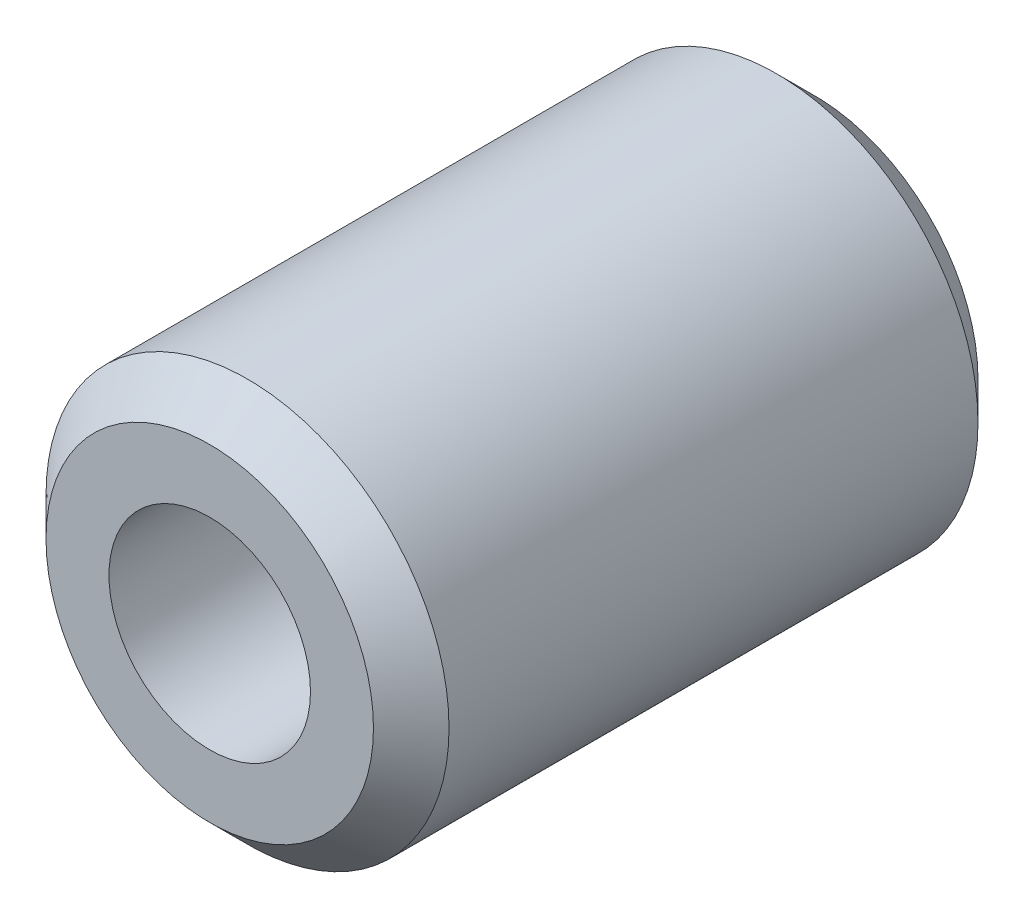
ISO-10303-21;
HEADER;
FILE_DESCRIPTION(('STEP AP214'),'2;1');
FILE_NAME('part.step','',(''),(''),'','','');
FILE_SCHEMA(('AUTOMOTIVE_DESIGN { 1 0 10303 214 1 1 1 1 }'));
ENDSEC;
DATA;
#1=APPLICATION_CONTEXT('core data for automotive mechanical design processes');
#2=APPLICATION_PROTOCOL_DEFINITION('international standard','automotive_design',2000,#1);
#3=PRODUCT_CONTEXT('',#1,'mechanical');
#4=PRODUCT('Part','Part','',(#3));
#5=PRODUCT_RELATED_PRODUCT_CATEGORY('part','',(#4));
#6=PRODUCT_DEFINITION_FORMATION('','',#4);
#7=PRODUCT_DEFINITION_CONTEXT('part definition',#1,'design');
#8=PRODUCT_DEFINITION('design','',#6,#7);
#9=PRODUCT_DEFINITION_SHAPE('','',#8);
#10=(LENGTH_UNIT() NAMED_UNIT(*) SI_UNIT(.MILLI.,.METRE.));
#11=(NAMED_UNIT(*) PLANE_ANGLE_UNIT() SI_UNIT($,.RADIAN.));
#12=(NAMED_UNIT(*) SI_UNIT($,.STERADIAN.) SOLID_ANGLE_UNIT());
#13=UNCERTAINTY_MEASURE_WITH_UNIT(LENGTH_MEASURE(1.E-05),#10,'distance_accuracy_value','');
#14=(GEOMETRIC_REPRESENTATION_CONTEXT(3) GLOBAL_UNCERTAINTY_ASSIGNED_CONTEXT((#13)) GLOBAL_UNIT_ASSIGNED_CONTEXT((#10,
#11,#12)) REPRESENTATION_CONTEXT('',''));
#15=CARTESIAN_POINT('',(0.,0.,0.));
#16=DIRECTION('',(0.,0.,1.));
#17=DIRECTION('',(1.,0.,0.));
#18=AXIS2_PLACEMENT_3D('',#15,#16,#17);
#19=CARTESIAN_POINT('',(0.,3.175,4.7625));
#20=DIRECTION('',(0.,0.,-1.));
#21=DIRECTION('',(-1.,0.,0.));
#22=AXIS2_PLACEMENT_3D('',#19,#20,#21);
#23=PLANE('',#22);
#24=CARTESIAN_POINT('',(0.,0.,4.7625));
#25=DIRECTION('',(0.,0.,-1.));
#26=DIRECTION('',(-1.,0.,0.));
#27=AXIS2_PLACEMENT_3D('',#24,#25,#26);
#28=CIRCLE('',#27,2.5796875);
#29=CARTESIAN_POINT('',(-2.5796875,0.,4.7625));
#30=VERTEX_POINT('',#29);
#31=EDGE_CURVE('E10',#30,#30,#28,.F.);
#32=ORIENTED_EDGE('',*,*,#31,.T.);
#33=EDGE_LOOP('',(#32));
#34=FACE_BOUND('',#33,.T.);
#35=CARTESIAN_POINT('',(0.,0.,4.7625));
#36=DIRECTION('',(0.,0.,1.));
#37=DIRECTION('',(1.,0.,0.));
#38=AXIS2_PLACEMENT_3D('',#35,#36,#37);
#39=CIRCLE('',#38,1.5875);
#40=CARTESIAN_POINT('',(1.5875,0.,4.7625));
#41=VERTEX_POINT('',#40);
#42=EDGE_CURVE('E61',#41,#41,#39,.T.);
#43=ORIENTED_EDGE('',*,*,#42,.F.);
#44=EDGE_LOOP('',(#43));
#45=FACE_BOUND('',#44,.T.);
#46=ADVANCED_FACE('F39',(#34,#45),#23,.F.);
#47=CARTESIAN_POINT('',(0.,0.,4.7625));
#48=DIRECTION('',(0.,0.,1.));
#49=DIRECTION('',(1.,0.,0.));
#50=AXIS2_PLACEMENT_3D('',#47,#48,#49);
#51=CYLINDRICAL_SURFACE('',#50,1.5875);
#52=CARTESIAN_POINT('',(0.,0.,-4.7625));
#53=DIRECTION('',(0.,0.,1.));
#54=DIRECTION('',(1.,0.,0.));
#55=AXIS2_PLACEMENT_3D('',#52,#53,#54);
#56=CIRCLE('',#55,1.5875);
#57=CARTESIAN_POINT('',(1.5875,0.,-4.7625));
#58=VERTEX_POINT('',#57);
#59=EDGE_CURVE('E67',#58,#58,#56,.T.);
#60=ORIENTED_EDGE('',*,*,#59,.F.);
#61=EDGE_LOOP('',(#60));
#62=FACE_BOUND('',#61,.T.);
#63=ORIENTED_EDGE('',*,*,#42,.T.);
#64=EDGE_LOOP('',(#63));
#65=FACE_BOUND('',#64,.T.);
#66=ADVANCED_FACE('F80',(#62,#65),#51,.F.);
#67=CARTESIAN_POINT('',(0.,1.5875,-4.7625));
#68=DIRECTION('',(0.,0.,1.));
#69=DIRECTION('',(1.,0.,0.));
#70=AXIS2_PLACEMENT_3D('',#67,#68,#69);
#71=PLANE('',#70);
#72=CARTESIAN_POINT('',(0.,0.,-4.7625));
#73=DIRECTION('',(0.,0.,1.));
#74=DIRECTION('',(1.,0.,0.));
#75=AXIS2_PLACEMENT_3D('',#72,#73,#74);
#76=CIRCLE('',#75,2.5796875);
#77=CARTESIAN_POINT('',(2.5796875,0.,-4.7625));
#78=VERTEX_POINT('',#77);
#79=EDGE_CURVE('E50',#78,#78,#76,.F.);
#80=ORIENTED_EDGE('',*,*,#79,.T.);
#81=EDGE_LOOP('',(#80));
#82=FACE_BOUND('',#81,.T.);
#83=ORIENTED_EDGE('',*,*,#59,.T.);
#84=EDGE_LOOP('',(#83));
#85=FACE_BOUND('',#84,.T.);
#86=ADVANCED_FACE('F71',(#82,#85),#71,.F.);
#87=CARTESIAN_POINT('',(0.,0.,4.7625));
#88=DIRECTION('',(0.,0.,1.));
#89=DIRECTION('',(1.,0.,0.));
#90=AXIS2_PLACEMENT_3D('',#87,#88,#89);
#91=CYLINDRICAL_SURFACE('',#90,3.175);
#92=CARTESIAN_POINT('',(0.,0.,-4.16718750000001));
#93=DIRECTION('',(0.,0.,1.));
#94=DIRECTION('',(1.,0.,0.));
#95=AXIS2_PLACEMENT_3D('',#92,#93,#94);
#96=CIRCLE('',#95,3.175);
#97=CARTESIAN_POINT('',(3.175,0.,-4.16718750000001));
#98=VERTEX_POINT('',#97);
#99=EDGE_CURVE('E52',#98,#98,#96,.T.);
#100=ORIENTED_EDGE('',*,*,#99,.T.);
#101=EDGE_LOOP('',(#100));
#102=FACE_BOUND('',#101,.T.);
#103=CARTESIAN_POINT('',(0.,0.,4.1671875));
#104=DIRECTION('',(0.,0.,-1.));
#105=DIRECTION('',(-1.,0.,0.));
#106=AXIS2_PLACEMENT_3D('',#103,#104,#105);
#107=CIRCLE('',#106,3.175);
#108=CARTESIAN_POINT('',(-3.175,0.,4.1671875));
#109=VERTEX_POINT('',#108);
#110=EDGE_CURVE('E56',#109,#109,#107,.T.);
#111=ORIENTED_EDGE('',*,*,#110,.T.);
#112=EDGE_LOOP('',(#111));
#113=FACE_BOUND('',#112,.T.);
#114=ADVANCED_FACE('F89',(#102,#113),#91,.T.);
#115=CARTESIAN_POINT('',(0.,0.,-4.16718750000001));
#116=DIRECTION('',(0.,0.,1.));
#117=DIRECTION('',(1.,0.,0.));
#118=AXIS2_PLACEMENT_3D('',#115,#116,#117);
#119=CONICAL_SURFACE('',#118,3.175,0.78539816339745);
#120=ORIENTED_EDGE('',*,*,#79,.F.);
#121=EDGE_LOOP('',(#120));
#122=FACE_BOUND('',#121,.T.);
#123=ORIENTED_EDGE('',*,*,#99,.F.);
#124=EDGE_LOOP('',(#123));
#125=FACE_BOUND('',#124,.T.);
#126=ADVANCED_FACE('F88',(#122,#125),#119,.T.);
#127=CARTESIAN_POINT('',(0.,0.,4.7625));
#128=DIRECTION('',(0.,0.,-1.));
#129=DIRECTION('',(-1.,0.,0.));
#130=AXIS2_PLACEMENT_3D('',#127,#128,#129);
#131=CONICAL_SURFACE('',#130,2.5796875,0.785398163397447);
#132=ORIENTED_EDGE('',*,*,#110,.F.);
#133=EDGE_LOOP('',(#132));
#134=FACE_BOUND('',#133,.T.);
#135=ORIENTED_EDGE('',*,*,#31,.F.);
#136=EDGE_LOOP('',(#135));
#137=FACE_BOUND('',#136,.T.);
#138=ADVANCED_FACE('F41',(#134,#137),#131,.T.);
#139=CLOSED_SHELL('',(#46,#66,#86,#114,#126,#138));
#140=MANIFOLD_SOLID_BREP('B2',#139);
#141=ADVANCED_BREP_SHAPE_REPRESENTATION('',(#18,#140),#14);
#142=SHAPE_DEFINITION_REPRESENTATION(#9,#141);
ENDSEC;
END-ISO-10303-21;
